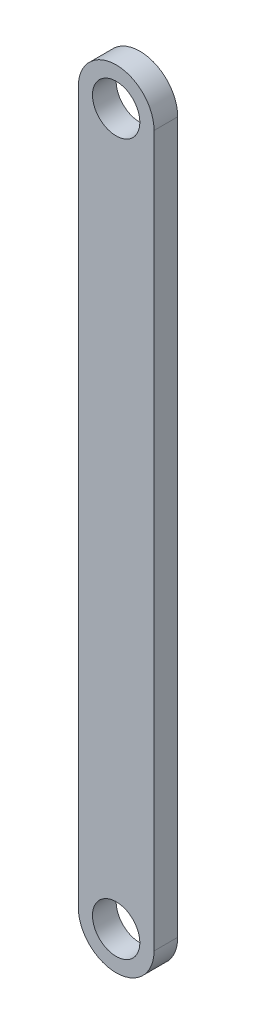
ISO-10303-21;
HEADER;
FILE_DESCRIPTION(('STEP AP214'),'2;1');
FILE_NAME('part.step','',(''),(''),'','','');
FILE_SCHEMA(('AUTOMOTIVE_DESIGN { 1 0 10303 214 1 1 1 1 }'));
ENDSEC;
DATA;
#1=APPLICATION_CONTEXT('core data for automotive mechanical design processes');
#2=APPLICATION_PROTOCOL_DEFINITION('international standard','automotive_design',2000,#1);
#3=PRODUCT_CONTEXT('',#1,'mechanical');
#4=PRODUCT('Part','Part','',(#3));
#5=PRODUCT_RELATED_PRODUCT_CATEGORY('part','',(#4));
#6=PRODUCT_DEFINITION_FORMATION('','',#4);
#7=PRODUCT_DEFINITION_CONTEXT('part definition',#1,'design');
#8=PRODUCT_DEFINITION('design','',#6,#7);
#9=PRODUCT_DEFINITION_SHAPE('','',#8);
#10=(LENGTH_UNIT() NAMED_UNIT(*) SI_UNIT(.MILLI.,.METRE.));
#11=(NAMED_UNIT(*) PLANE_ANGLE_UNIT() SI_UNIT($,.RADIAN.));
#12=(NAMED_UNIT(*) SI_UNIT($,.STERADIAN.) SOLID_ANGLE_UNIT());
#13=UNCERTAINTY_MEASURE_WITH_UNIT(LENGTH_MEASURE(1.E-05),#10,'distance_accuracy_value','');
#14=(GEOMETRIC_REPRESENTATION_CONTEXT(3) GLOBAL_UNCERTAINTY_ASSIGNED_CONTEXT((#13)) GLOBAL_UNIT_ASSIGNED_CONTEXT((#10,
#11,#12)) REPRESENTATION_CONTEXT('',''));
#15=CARTESIAN_POINT('',(0.,0.,0.));
#16=DIRECTION('',(0.,0.,1.));
#17=DIRECTION('',(1.,0.,0.));
#18=AXIS2_PLACEMENT_3D('',#15,#16,#17);
#19=CARTESIAN_POINT('',(0.,11.3207760314342,0.5));
#20=DIRECTION('',(0.,0.,1.));
#21=DIRECTION('',(1.,0.,0.));
#22=AXIS2_PLACEMENT_3D('',#19,#20,#21);
#23=PLANE('',#22);
#24=CARTESIAN_POINT('',(0.,11.3207760314342,0.5));
#25=DIRECTION('',(0.,0.,1.));
#26=DIRECTION('',(1.,0.,0.));
#27=AXIS2_PLACEMENT_3D('',#24,#25,#26);
#28=CIRCLE('',#27,0.5);
#29=CARTESIAN_POINT('',(0.500000000000001,11.3207760314342,0.5));
#30=VERTEX_POINT('',#29);
#31=EDGE_CURVE('E99',#30,#30,#28,.T.);
#32=ORIENTED_EDGE('',*,*,#31,.F.);
#33=EDGE_LOOP('',(#32));
#34=FACE_BOUND('',#33,.T.);
#35=CARTESIAN_POINT('',(0.,11.3207760314342,0.5));
#36=DIRECTION('',(0.,0.,1.));
#37=DIRECTION('',(1.,0.,0.));
#38=AXIS2_PLACEMENT_3D('',#35,#36,#37);
#39=CIRCLE('',#38,0.8);
#40=CARTESIAN_POINT('',(0.8,11.3207760314342,0.5));
#41=VERTEX_POINT('',#40);
#42=CARTESIAN_POINT('',(-0.8,11.3207760314342,0.5));
#43=VERTEX_POINT('',#42);
#44=EDGE_CURVE('E84',#41,#43,#39,.T.);
#45=ORIENTED_EDGE('',*,*,#44,.T.);
#46=DIRECTION('',(0.,-1.,0.));
#47=VECTOR('',#46,1.);
#48=CARTESIAN_POINT('',(-0.8,11.3207760314342,0.5));
#49=LINE('',#48,#47);
#50=CARTESIAN_POINT('',(-0.8,-3.67922396856582,0.5));
#51=VERTEX_POINT('',#50);
#52=EDGE_CURVE('E79',#43,#51,#49,.T.);
#53=ORIENTED_EDGE('',*,*,#52,.T.);
#54=CARTESIAN_POINT('',(0.,-3.67922396856582,0.5));
#55=DIRECTION('',(0.,0.,1.));
#56=DIRECTION('',(1.,0.,0.));
#57=AXIS2_PLACEMENT_3D('',#54,#55,#56);
#58=CIRCLE('',#57,0.8);
#59=CARTESIAN_POINT('',(0.800000000000002,-3.67922396856582,0.5));
#60=VERTEX_POINT('',#59);
#61=EDGE_CURVE('E82',#51,#60,#58,.T.);
#62=ORIENTED_EDGE('',*,*,#61,.T.);
#63=DIRECTION('',(0.,1.,0.));
#64=VECTOR('',#63,1.);
#65=CARTESIAN_POINT('',(0.8,11.3207760314342,0.5));
#66=LINE('',#65,#64);
#67=EDGE_CURVE('E49',#60,#41,#66,.T.);
#68=ORIENTED_EDGE('',*,*,#67,.T.);
#69=EDGE_LOOP('',(#45,#53,#62,#68));
#70=FACE_BOUND('',#69,.T.);
#71=CARTESIAN_POINT('',(0.,-3.67922396856582,0.5));
#72=DIRECTION('',(0.,0.,1.));
#73=DIRECTION('',(1.,0.,0.));
#74=AXIS2_PLACEMENT_3D('',#71,#72,#73);
#75=CIRCLE('',#74,0.5);
#76=CARTESIAN_POINT('',(0.5,-3.67922396856582,0.5));
#77=VERTEX_POINT('',#76);
#78=EDGE_CURVE('E114',#77,#77,#75,.T.);
#79=ORIENTED_EDGE('',*,*,#78,.F.);
#80=EDGE_LOOP('',(#79));
#81=FACE_BOUND('',#80,.T.);
#82=ADVANCED_FACE('F32',(#34,#70,#81),#23,.T.);
#83=CARTESIAN_POINT('',(0.,11.3207760314342,0.));
#84=DIRECTION('',(0.,0.,1.));
#85=DIRECTION('',(1.,0.,0.));
#86=AXIS2_PLACEMENT_3D('',#83,#84,#85);
#87=PLANE('',#86);
#88=CARTESIAN_POINT('',(0.,11.3207760314342,0.));
#89=DIRECTION('',(0.,0.,1.));
#90=DIRECTION('',(1.,0.,0.));
#91=AXIS2_PLACEMENT_3D('',#88,#89,#90);
#92=CIRCLE('',#91,0.8);
#93=CARTESIAN_POINT('',(0.8,11.3207760314342,0.));
#94=VERTEX_POINT('',#93);
#95=CARTESIAN_POINT('',(-0.8,11.3207760314342,0.));
#96=VERTEX_POINT('',#95);
#97=EDGE_CURVE('E96',#94,#96,#92,.T.);
#98=ORIENTED_EDGE('',*,*,#97,.F.);
#99=DIRECTION('',(0.,1.,0.));
#100=VECTOR('',#99,1.);
#101=CARTESIAN_POINT('',(0.8,11.3207760314342,0.));
#102=LINE('',#101,#100);
#103=CARTESIAN_POINT('',(0.800000000000002,-3.67922396856582,0.));
#104=VERTEX_POINT('',#103);
#105=EDGE_CURVE('E72',#104,#94,#102,.T.);
#106=ORIENTED_EDGE('',*,*,#105,.F.);
#107=CARTESIAN_POINT('',(0.,-3.67922396856582,0.));
#108=DIRECTION('',(0.,0.,1.));
#109=DIRECTION('',(1.,0.,0.));
#110=AXIS2_PLACEMENT_3D('',#107,#108,#109);
#111=CIRCLE('',#110,0.8);
#112=CARTESIAN_POINT('',(-0.8,-3.67922396856582,0.));
#113=VERTEX_POINT('',#112);
#114=EDGE_CURVE('E66',#113,#104,#111,.T.);
#115=ORIENTED_EDGE('',*,*,#114,.F.);
#116=DIRECTION('',(0.,-1.,0.));
#117=VECTOR('',#116,1.);
#118=CARTESIAN_POINT('',(-0.8,11.3207760314342,0.));
#119=LINE('',#118,#117);
#120=EDGE_CURVE('E88',#96,#113,#119,.T.);
#121=ORIENTED_EDGE('',*,*,#120,.F.);
#122=EDGE_LOOP('',(#98,#106,#115,#121));
#123=FACE_BOUND('',#122,.T.);
#124=CARTESIAN_POINT('',(0.,11.3207760314342,0.));
#125=DIRECTION('',(0.,0.,1.));
#126=DIRECTION('',(1.,0.,0.));
#127=AXIS2_PLACEMENT_3D('',#124,#125,#126);
#128=CIRCLE('',#127,0.5);
#129=CARTESIAN_POINT('',(0.500000000000001,11.3207760314342,0.));
#130=VERTEX_POINT('',#129);
#131=EDGE_CURVE('E111',#130,#130,#128,.T.);
#132=ORIENTED_EDGE('',*,*,#131,.T.);
#133=EDGE_LOOP('',(#132));
#134=FACE_BOUND('',#133,.T.);
#135=CARTESIAN_POINT('',(0.,-3.67922396856582,0.));
#136=DIRECTION('',(0.,0.,1.));
#137=DIRECTION('',(1.,0.,0.));
#138=AXIS2_PLACEMENT_3D('',#135,#136,#137);
#139=CIRCLE('',#138,0.5);
#140=CARTESIAN_POINT('',(0.5,-3.67922396856582,0.));
#141=VERTEX_POINT('',#140);
#142=EDGE_CURVE('E117',#141,#141,#139,.T.);
#143=ORIENTED_EDGE('',*,*,#142,.T.);
#144=EDGE_LOOP('',(#143));
#145=FACE_BOUND('',#144,.T.);
#146=ADVANCED_FACE('F107',(#123,#134,#145),#87,.F.);
#147=CARTESIAN_POINT('',(0.,11.3207760314342,0.5));
#148=DIRECTION('',(0.,0.,-1.));
#149=DIRECTION('',(-1.,0.,0.));
#150=AXIS2_PLACEMENT_3D('',#147,#148,#149);
#151=CYLINDRICAL_SURFACE('',#150,0.8);
#152=ORIENTED_EDGE('',*,*,#97,.T.);
#153=DIRECTION('',(0.,0.,-1.));
#154=VECTOR('',#153,1.);
#155=CARTESIAN_POINT('',(-0.8,11.3207760314342,0.5));
#156=LINE('',#155,#154);
#157=EDGE_CURVE('E11',#43,#96,#156,.T.);
#158=ORIENTED_EDGE('',*,*,#157,.F.);
#159=ORIENTED_EDGE('',*,*,#44,.F.);
#160=DIRECTION('',(0.,0.,-1.));
#161=VECTOR('',#160,1.);
#162=CARTESIAN_POINT('',(0.8,11.3207760314342,0.5));
#163=LINE('',#162,#161);
#164=EDGE_CURVE('E92',#41,#94,#163,.T.);
#165=ORIENTED_EDGE('',*,*,#164,.T.);
#166=EDGE_LOOP('',(#152,#158,#159,#165));
#167=FACE_BOUND('',#166,.T.);
#168=ADVANCED_FACE('F34',(#167),#151,.T.);
#169=CARTESIAN_POINT('',(-0.8,11.3207760314342,0.5));
#170=DIRECTION('',(1.,0.,0.));
#171=DIRECTION('',(0.,1.,0.));
#172=AXIS2_PLACEMENT_3D('',#169,#170,#171);
#173=PLANE('',#172);
#174=ORIENTED_EDGE('',*,*,#120,.T.);
#175=DIRECTION('',(0.,0.,-1.));
#176=VECTOR('',#175,1.);
#177=CARTESIAN_POINT('',(-0.8,-3.67922396856582,0.5));
#178=LINE('',#177,#176);
#179=EDGE_CURVE('E41',#51,#113,#178,.T.);
#180=ORIENTED_EDGE('',*,*,#179,.F.);
#181=ORIENTED_EDGE('',*,*,#52,.F.);
#182=ORIENTED_EDGE('',*,*,#157,.T.);
#183=EDGE_LOOP('',(#174,#180,#181,#182));
#184=FACE_BOUND('',#183,.T.);
#185=ADVANCED_FACE('F87',(#184),#173,.F.);
#186=CARTESIAN_POINT('',(0.,-3.67922396856582,0.5));
#187=DIRECTION('',(0.,0.,-1.));
#188=DIRECTION('',(-1.,0.,0.));
#189=AXIS2_PLACEMENT_3D('',#186,#187,#188);
#190=CYLINDRICAL_SURFACE('',#189,0.8);
#191=ORIENTED_EDGE('',*,*,#114,.T.);
#192=DIRECTION('',(0.,0.,-1.));
#193=VECTOR('',#192,1.);
#194=CARTESIAN_POINT('',(0.800000000000002,-3.67922396856582,0.5));
#195=LINE('',#194,#193);
#196=EDGE_CURVE('E89',#60,#104,#195,.T.);
#197=ORIENTED_EDGE('',*,*,#196,.F.);
#198=ORIENTED_EDGE('',*,*,#61,.F.);
#199=ORIENTED_EDGE('',*,*,#179,.T.);
#200=EDGE_LOOP('',(#191,#197,#198,#199));
#201=FACE_BOUND('',#200,.T.);
#202=ADVANCED_FACE('F90',(#201),#190,.T.);
#203=CARTESIAN_POINT('',(0.8,11.3207760314342,0.5));
#204=DIRECTION('',(-1.,0.,0.));
#205=DIRECTION('',(0.,-1.,0.));
#206=AXIS2_PLACEMENT_3D('',#203,#204,#205);
#207=PLANE('',#206);
#208=ORIENTED_EDGE('',*,*,#105,.T.);
#209=ORIENTED_EDGE('',*,*,#164,.F.);
#210=ORIENTED_EDGE('',*,*,#67,.F.);
#211=ORIENTED_EDGE('',*,*,#196,.T.);
#212=EDGE_LOOP('',(#208,#209,#210,#211));
#213=FACE_BOUND('',#212,.T.);
#214=ADVANCED_FACE('F104',(#213),#207,.F.);
#215=CARTESIAN_POINT('',(0.,11.3207760314342,0.5));
#216=DIRECTION('',(0.,0.,-1.));
#217=DIRECTION('',(-1.,0.,0.));
#218=AXIS2_PLACEMENT_3D('',#215,#216,#217);
#219=CYLINDRICAL_SURFACE('',#218,0.5);
#220=ORIENTED_EDGE('',*,*,#31,.T.);
#221=EDGE_LOOP('',(#220));
#222=FACE_BOUND('',#221,.T.);
#223=ORIENTED_EDGE('',*,*,#131,.F.);
#224=EDGE_LOOP('',(#223));
#225=FACE_BOUND('',#224,.T.);
#226=ADVANCED_FACE('F134',(#222,#225),#219,.F.);
#227=CARTESIAN_POINT('',(0.,-3.67922396856582,0.5));
#228=DIRECTION('',(0.,0.,-1.));
#229=DIRECTION('',(-1.,0.,0.));
#230=AXIS2_PLACEMENT_3D('',#227,#228,#229);
#231=CYLINDRICAL_SURFACE('',#230,0.5);
#232=ORIENTED_EDGE('',*,*,#78,.T.);
#233=EDGE_LOOP('',(#232));
#234=FACE_BOUND('',#233,.T.);
#235=ORIENTED_EDGE('',*,*,#142,.F.);
#236=EDGE_LOOP('',(#235));
#237=FACE_BOUND('',#236,.T.);
#238=ADVANCED_FACE('F123',(#234,#237),#231,.F.);
#239=CLOSED_SHELL('',(#82,#146,#168,#185,#202,#214,#226,#238));
#240=MANIFOLD_SOLID_BREP('B2',#239);
#241=ADVANCED_BREP_SHAPE_REPRESENTATION('',(#18,#240),#14);
#242=SHAPE_DEFINITION_REPRESENTATION(#9,#241);
ENDSEC;
END-ISO-10303-21;
